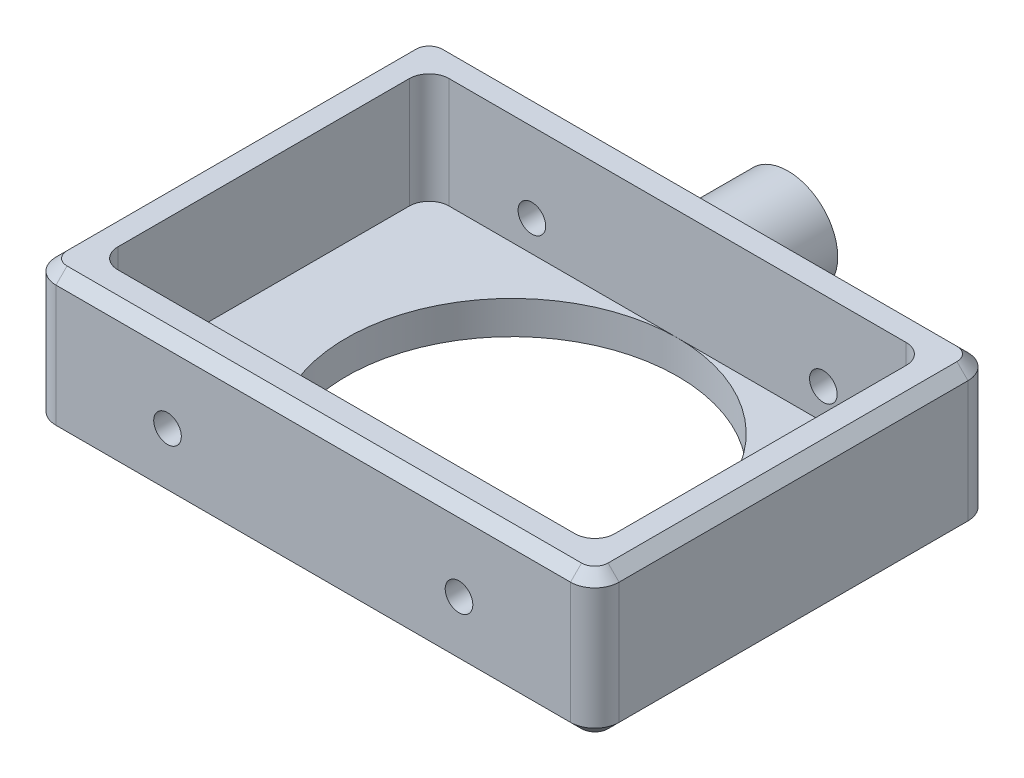
ISO-10303-21;
HEADER;
FILE_DESCRIPTION(('STEP AP214'),'2;1');
FILE_NAME('part.step','',(''),(''),'','','');
FILE_SCHEMA(('AUTOMOTIVE_DESIGN { 1 0 10303 214 1 1 1 1 }'));
ENDSEC;
DATA;
#1=APPLICATION_CONTEXT('core data for automotive mechanical design processes');
#2=APPLICATION_PROTOCOL_DEFINITION('international standard','automotive_design',2000,#1);
#3=PRODUCT_CONTEXT('',#1,'mechanical');
#4=PRODUCT('Part','Part','',(#3));
#5=PRODUCT_RELATED_PRODUCT_CATEGORY('part','',(#4));
#6=PRODUCT_DEFINITION_FORMATION('','',#4);
#7=PRODUCT_DEFINITION_CONTEXT('part definition',#1,'design');
#8=PRODUCT_DEFINITION('design','',#6,#7);
#9=PRODUCT_DEFINITION_SHAPE('','',#8);
#10=(LENGTH_UNIT() NAMED_UNIT(*) SI_UNIT(.MILLI.,.METRE.));
#11=(NAMED_UNIT(*) PLANE_ANGLE_UNIT() SI_UNIT($,.RADIAN.));
#12=(NAMED_UNIT(*) SI_UNIT($,.STERADIAN.) SOLID_ANGLE_UNIT());
#13=UNCERTAINTY_MEASURE_WITH_UNIT(LENGTH_MEASURE(1.E-05),#10,'distance_accuracy_value','');
#14=(GEOMETRIC_REPRESENTATION_CONTEXT(3) GLOBAL_UNCERTAINTY_ASSIGNED_CONTEXT((#13)) GLOBAL_UNIT_ASSIGNED_CONTEXT((#10,
#11,#12)) REPRESENTATION_CONTEXT('',''));
#15=CARTESIAN_POINT('',(0.,0.,0.));
#16=DIRECTION('',(0.,0.,1.));
#17=DIRECTION('',(1.,0.,0.));
#18=AXIS2_PLACEMENT_3D('',#15,#16,#17);
#19=CARTESIAN_POINT('',(-25.5,3.,-18.));
#20=DIRECTION('',(0.,0.,1.));
#21=DIRECTION('',(1.,0.,0.));
#22=AXIS2_PLACEMENT_3D('',#19,#20,#21);
#23=PLANE('',#22);
#24=DIRECTION('',(0.,-1.,0.));
#25=VECTOR('',#24,1.);
#26=CARTESIAN_POINT('',(-23.3,3.,-18.));
#27=LINE('',#26,#25);
#28=CARTESIAN_POINT('',(-23.3,1.00000000000001,-18.));
#29=VERTEX_POINT('',#28);
#30=CARTESIAN_POINT('',(-23.3,12.,-18.));
#31=VERTEX_POINT('',#30);
#32=EDGE_CURVE('E291',#29,#31,#27,.F.);
#33=ORIENTED_EDGE('',*,*,#32,.T.);
#34=DIRECTION('',(1.,0.,0.));
#35=VECTOR('',#34,1.);
#36=CARTESIAN_POINT('',(23.3,12.,-18.));
#37=LINE('',#36,#35);
#38=CARTESIAN_POINT('',(23.3,12.,-18.));
#39=VERTEX_POINT('',#38);
#40=EDGE_CURVE('E391',#31,#39,#37,.T.);
#41=ORIENTED_EDGE('',*,*,#40,.T.);
#42=DIRECTION('',(0.,-1.,0.));
#43=VECTOR('',#42,1.);
#44=CARTESIAN_POINT('',(23.3,3.,-18.));
#45=LINE('',#44,#43);
#46=CARTESIAN_POINT('',(23.3,1.00000000000001,-18.));
#47=VERTEX_POINT('',#46);
#48=EDGE_CURVE('E289',#39,#47,#45,.T.);
#49=ORIENTED_EDGE('',*,*,#48,.T.);
#50=DIRECTION('',(-1.,0.,0.));
#51=VECTOR('',#50,1.);
#52=CARTESIAN_POINT('',(-23.3,1.00000000000001,-18.));
#53=LINE('',#52,#51);
#54=EDGE_CURVE('E338',#47,#29,#53,.T.);
#55=ORIENTED_EDGE('',*,*,#54,.T.);
#56=EDGE_LOOP('',(#33,#41,#49,#55));
#57=FACE_BOUND('',#56,.T.);
#58=CARTESIAN_POINT('',(-13.2,5.8,-18.));
#59=DIRECTION('',(0.,0.,1.));
#60=DIRECTION('',(1.,0.,0.));
#61=AXIS2_PLACEMENT_3D('',#58,#59,#60);
#62=CIRCLE('',#61,1.25);
#63=CARTESIAN_POINT('',(-11.95,5.8,-18.));
#64=VERTEX_POINT('',#63);
#65=EDGE_CURVE('E214',#64,#64,#62,.T.);
#66=ORIENTED_EDGE('',*,*,#65,.T.);
#67=EDGE_LOOP('',(#66));
#68=FACE_BOUND('',#67,.T.);
#69=CARTESIAN_POINT('',(13.2,5.8,-18.));
#70=DIRECTION('',(0.,0.,1.));
#71=DIRECTION('',(1.,0.,0.));
#72=AXIS2_PLACEMENT_3D('',#69,#70,#71);
#73=CIRCLE('',#72,1.25);
#74=CARTESIAN_POINT('',(14.45,5.8,-18.));
#75=VERTEX_POINT('',#74);
#76=EDGE_CURVE('E438',#75,#75,#73,.T.);
#77=ORIENTED_EDGE('',*,*,#76,.T.);
#78=EDGE_LOOP('',(#77));
#79=FACE_BOUND('',#78,.T.);
#80=CARTESIAN_POINT('',(0.,6.60000000000001,-18.));
#81=DIRECTION('',(0.,0.,1.));
#82=DIRECTION('',(1.,0.,0.));
#83=AXIS2_PLACEMENT_3D('',#80,#81,#82);
#84=CIRCLE('',#83,4.5);
#85=CARTESIAN_POINT('',(4.5,6.60000000000001,-18.));
#86=VERTEX_POINT('',#85);
#87=EDGE_CURVE('E11',#86,#86,#84,.F.);
#88=ORIENTED_EDGE('',*,*,#87,.F.);
#89=EDGE_LOOP('',(#88));
#90=FACE_BOUND('',#89,.T.);
#91=ADVANCED_FACE('F39',(#57,#68,#79,#90),#23,.F.);
#92=CARTESIAN_POINT('',(0.,3.,0.));
#93=DIRECTION('',(0.,-1.,0.));
#94=DIRECTION('',(0.,0.,-1.));
#95=AXIS2_PLACEMENT_3D('',#92,#93,#94);
#96=PLANE('',#95);
#97=CARTESIAN_POINT('',(0.,3.,0.));
#98=DIRECTION('',(0.,1.,0.));
#99=DIRECTION('',(0.,0.,1.));
#100=AXIS2_PLACEMENT_3D('',#97,#98,#99);
#101=CIRCLE('',#100,15.);
#102=CARTESIAN_POINT('',(0.,3.,15.));
#103=VERTEX_POINT('',#102);
#104=CARTESIAN_POINT('',(0.,3.,-15.));
#105=VERTEX_POINT('',#104);
#106=EDGE_CURVE('E209',#103,#105,#101,.T.);
#107=ORIENTED_EDGE('',*,*,#106,.F.);
#108=DIRECTION('',(1.,0.,0.));
#109=VECTOR('',#108,1.);
#110=CARTESIAN_POINT('',(0.,3.,15.));
#111=LINE('',#110,#109);
#112=CARTESIAN_POINT('',(20.7,3.,15.));
#113=VERTEX_POINT('',#112);
#114=EDGE_CURVE('E219',#103,#113,#111,.T.);
#115=ORIENTED_EDGE('',*,*,#114,.T.);
#116=CARTESIAN_POINT('',(20.7,3.,13.2));
#117=DIRECTION('',(0.,-1.,0.));
#118=DIRECTION('',(0.,0.,-1.));
#119=AXIS2_PLACEMENT_3D('',#116,#117,#118);
#120=CIRCLE('',#119,1.8);
#121=CARTESIAN_POINT('',(22.5,3.,13.2));
#122=VERTEX_POINT('',#121);
#123=EDGE_CURVE('E259',#113,#122,#120,.F.);
#124=ORIENTED_EDGE('',*,*,#123,.T.);
#125=DIRECTION('',(0.,0.,1.));
#126=VECTOR('',#125,1.);
#127=CARTESIAN_POINT('',(22.5,3.,0.));
#128=LINE('',#127,#126);
#129=CARTESIAN_POINT('',(22.5,3.,-13.2));
#130=VERTEX_POINT('',#129);
#131=EDGE_CURVE('E247',#130,#122,#128,.T.);
#132=ORIENTED_EDGE('',*,*,#131,.F.);
#133=CARTESIAN_POINT('',(20.7,3.,-13.2));
#134=DIRECTION('',(0.,-1.,0.));
#135=DIRECTION('',(0.,0.,-1.));
#136=AXIS2_PLACEMENT_3D('',#133,#134,#135);
#137=CIRCLE('',#136,1.8);
#138=CARTESIAN_POINT('',(20.7,3.,-15.));
#139=VERTEX_POINT('',#138);
#140=EDGE_CURVE('E256',#130,#139,#137,.F.);
#141=ORIENTED_EDGE('',*,*,#140,.T.);
#142=DIRECTION('',(1.,0.,0.));
#143=VECTOR('',#142,1.);
#144=CARTESIAN_POINT('',(0.,3.,-15.));
#145=LINE('',#144,#143);
#146=EDGE_CURVE('E222',#105,#139,#145,.T.);
#147=ORIENTED_EDGE('',*,*,#146,.F.);
#148=EDGE_LOOP('',(#107,#115,#124,#132,#141,#147));
#149=FACE_BOUND('',#148,.T.);
#150=ADVANCED_FACE('F218',(#149),#96,.F.);
#151=EDGE_CURVE('E206',#105,#103,#101,.T.);
#152=ORIENTED_EDGE('',*,*,#151,.F.);
#153=CARTESIAN_POINT('',(-20.7,3.,-15.));
#154=VERTEX_POINT('',#153);
#155=EDGE_CURVE('E245',#154,#105,#145,.T.);
#156=ORIENTED_EDGE('',*,*,#155,.F.);
#157=CARTESIAN_POINT('',(-20.7,3.,-13.2));
#158=DIRECTION('',(0.,-1.,0.));
#159=DIRECTION('',(0.,0.,-1.));
#160=AXIS2_PLACEMENT_3D('',#157,#158,#159);
#161=CIRCLE('',#160,1.8);
#162=CARTESIAN_POINT('',(-22.5,3.,-13.2));
#163=VERTEX_POINT('',#162);
#164=EDGE_CURVE('E254',#154,#163,#161,.F.);
#165=ORIENTED_EDGE('',*,*,#164,.T.);
#166=DIRECTION('',(0.,0.,1.));
#167=VECTOR('',#166,1.);
#168=CARTESIAN_POINT('',(-22.5,3.,0.));
#169=LINE('',#168,#167);
#170=CARTESIAN_POINT('',(-22.5,3.,13.2));
#171=VERTEX_POINT('',#170);
#172=EDGE_CURVE('E239',#163,#171,#169,.T.);
#173=ORIENTED_EDGE('',*,*,#172,.T.);
#174=CARTESIAN_POINT('',(-20.7,3.,13.2));
#175=DIRECTION('',(0.,-1.,0.));
#176=DIRECTION('',(0.,0.,-1.));
#177=AXIS2_PLACEMENT_3D('',#174,#175,#176);
#178=CIRCLE('',#177,1.8);
#179=CARTESIAN_POINT('',(-20.7,3.,15.));
#180=VERTEX_POINT('',#179);
#181=EDGE_CURVE('E238',#171,#180,#178,.F.);
#182=ORIENTED_EDGE('',*,*,#181,.T.);
#183=EDGE_CURVE('E230',#180,#103,#111,.T.);
#184=ORIENTED_EDGE('',*,*,#183,.T.);
#185=EDGE_LOOP('',(#152,#156,#165,#173,#182,#184));
#186=FACE_BOUND('',#185,.T.);
#187=ADVANCED_FACE('F236',(#186),#96,.F.);
#188=CARTESIAN_POINT('',(25.5,3.,18.));
#189=DIRECTION('',(-1.,0.,0.));
#190=DIRECTION('',(0.,0.,1.));
#191=AXIS2_PLACEMENT_3D('',#188,#189,#190);
#192=PLANE('',#191);
#193=DIRECTION('',(0.,-1.,0.));
#194=VECTOR('',#193,1.);
#195=CARTESIAN_POINT('',(25.5,3.,-15.8));
#196=LINE('',#195,#194);
#197=CARTESIAN_POINT('',(25.5,1.00000000000001,-15.8));
#198=VERTEX_POINT('',#197);
#199=CARTESIAN_POINT('',(25.5,12.,-15.8));
#200=VERTEX_POINT('',#199);
#201=EDGE_CURVE('E300',#198,#200,#196,.F.);
#202=ORIENTED_EDGE('',*,*,#201,.T.);
#203=DIRECTION('',(0.,0.,1.));
#204=VECTOR('',#203,1.);
#205=CARTESIAN_POINT('',(25.5,12.,15.8));
#206=LINE('',#205,#204);
#207=CARTESIAN_POINT('',(25.5,12.,15.8));
#208=VERTEX_POINT('',#207);
#209=EDGE_CURVE('E400',#200,#208,#206,.T.);
#210=ORIENTED_EDGE('',*,*,#209,.T.);
#211=DIRECTION('',(0.,-1.,0.));
#212=VECTOR('',#211,1.);
#213=CARTESIAN_POINT('',(25.5,3.,15.8));
#214=LINE('',#213,#212);
#215=CARTESIAN_POINT('',(25.5,1.00000000000001,15.8));
#216=VERTEX_POINT('',#215);
#217=EDGE_CURVE('E298',#208,#216,#214,.T.);
#218=ORIENTED_EDGE('',*,*,#217,.T.);
#219=DIRECTION('',(0.,0.,-1.));
#220=VECTOR('',#219,1.);
#221=CARTESIAN_POINT('',(25.5,1.00000000000001,-15.8));
#222=LINE('',#221,#220);
#223=EDGE_CURVE('E325',#216,#198,#222,.T.);
#224=ORIENTED_EDGE('',*,*,#223,.T.);
#225=EDGE_LOOP('',(#202,#210,#218,#224));
#226=FACE_BOUND('',#225,.T.);
#227=ADVANCED_FACE('F507',(#226),#192,.F.);
#228=CARTESIAN_POINT('',(-25.5,3.,18.));
#229=DIRECTION('',(1.,0.,0.));
#230=DIRECTION('',(0.,0.,-1.));
#231=AXIS2_PLACEMENT_3D('',#228,#229,#230);
#232=PLANE('',#231);
#233=DIRECTION('',(0.,-1.,0.));
#234=VECTOR('',#233,1.);
#235=CARTESIAN_POINT('',(-25.5,3.,15.8));
#236=LINE('',#235,#234);
#237=CARTESIAN_POINT('',(-25.5,1.00000000000001,15.8));
#238=VERTEX_POINT('',#237);
#239=CARTESIAN_POINT('',(-25.5,12.,15.8));
#240=VERTEX_POINT('',#239);
#241=EDGE_CURVE('E284',#238,#240,#236,.F.);
#242=ORIENTED_EDGE('',*,*,#241,.T.);
#243=DIRECTION('',(0.,0.,-1.));
#244=VECTOR('',#243,1.);
#245=CARTESIAN_POINT('',(-25.5,12.,-15.8));
#246=LINE('',#245,#244);
#247=CARTESIAN_POINT('',(-25.5,12.,-15.8));
#248=VERTEX_POINT('',#247);
#249=EDGE_CURVE('E398',#240,#248,#246,.T.);
#250=ORIENTED_EDGE('',*,*,#249,.T.);
#251=DIRECTION('',(0.,-1.,0.));
#252=VECTOR('',#251,1.);
#253=CARTESIAN_POINT('',(-25.5,3.,-15.8));
#254=LINE('',#253,#252);
#255=CARTESIAN_POINT('',(-25.5,1.00000000000001,-15.8));
#256=VERTEX_POINT('',#255);
#257=EDGE_CURVE('E287',#248,#256,#254,.T.);
#258=ORIENTED_EDGE('',*,*,#257,.T.);
#259=DIRECTION('',(0.,0.,1.));
#260=VECTOR('',#259,1.);
#261=CARTESIAN_POINT('',(-25.5,1.00000000000001,15.8));
#262=LINE('',#261,#260);
#263=EDGE_CURVE('E333',#256,#238,#262,.T.);
#264=ORIENTED_EDGE('',*,*,#263,.T.);
#265=EDGE_LOOP('',(#242,#250,#258,#264));
#266=FACE_BOUND('',#265,.T.);
#267=ADVANCED_FACE('F505',(#266),#232,.F.);
#268=CARTESIAN_POINT('',(-25.5,3.,18.));
#269=DIRECTION('',(0.,0.,-1.));
#270=DIRECTION('',(-1.,0.,0.));
#271=AXIS2_PLACEMENT_3D('',#268,#269,#270);
#272=PLANE('',#271);
#273=CARTESIAN_POINT('',(13.2,5.8,18.));
#274=DIRECTION('',(0.,0.,1.));
#275=DIRECTION('',(1.,0.,0.));
#276=AXIS2_PLACEMENT_3D('',#273,#274,#275);
#277=CIRCLE('',#276,1.25);
#278=CARTESIAN_POINT('',(14.45,5.8,18.));
#279=VERTEX_POINT('',#278);
#280=EDGE_CURVE('E374',#279,#279,#277,.T.);
#281=ORIENTED_EDGE('',*,*,#280,.F.);
#282=EDGE_LOOP('',(#281));
#283=FACE_BOUND('',#282,.T.);
#284=CARTESIAN_POINT('',(-13.2,5.8,18.));
#285=DIRECTION('',(0.,0.,1.));
#286=DIRECTION('',(1.,0.,0.));
#287=AXIS2_PLACEMENT_3D('',#284,#285,#286);
#288=CIRCLE('',#287,1.25);
#289=CARTESIAN_POINT('',(-11.95,5.8,18.));
#290=VERTEX_POINT('',#289);
#291=EDGE_CURVE('E369',#290,#290,#288,.T.);
#292=ORIENTED_EDGE('',*,*,#291,.F.);
#293=EDGE_LOOP('',(#292));
#294=FACE_BOUND('',#293,.T.);
#295=DIRECTION('',(0.,-1.,0.));
#296=VECTOR('',#295,1.);
#297=CARTESIAN_POINT('',(23.3,3.,18.));
#298=LINE('',#297,#296);
#299=CARTESIAN_POINT('',(23.3,1.00000000000001,18.));
#300=VERTEX_POINT('',#299);
#301=CARTESIAN_POINT('',(23.3,12.,18.));
#302=VERTEX_POINT('',#301);
#303=EDGE_CURVE('E294',#300,#302,#298,.F.);
#304=ORIENTED_EDGE('',*,*,#303,.T.);
#305=DIRECTION('',(-1.,0.,0.));
#306=VECTOR('',#305,1.);
#307=CARTESIAN_POINT('',(-23.3,12.,18.));
#308=LINE('',#307,#306);
#309=CARTESIAN_POINT('',(-23.3,12.,18.));
#310=VERTEX_POINT('',#309);
#311=EDGE_CURVE('E47',#302,#310,#308,.T.);
#312=ORIENTED_EDGE('',*,*,#311,.T.);
#313=DIRECTION('',(0.,-1.,0.));
#314=VECTOR('',#313,1.);
#315=CARTESIAN_POINT('',(-23.3,3.,18.));
#316=LINE('',#315,#314);
#317=CARTESIAN_POINT('',(-23.3,1.00000000000001,18.));
#318=VERTEX_POINT('',#317);
#319=EDGE_CURVE('E296',#310,#318,#316,.T.);
#320=ORIENTED_EDGE('',*,*,#319,.T.);
#321=DIRECTION('',(1.,0.,0.));
#322=VECTOR('',#321,1.);
#323=CARTESIAN_POINT('',(23.3,1.00000000000001,18.));
#324=LINE('',#323,#322);
#325=EDGE_CURVE('E323',#318,#300,#324,.T.);
#326=ORIENTED_EDGE('',*,*,#325,.T.);
#327=EDGE_LOOP('',(#304,#312,#320,#326));
#328=FACE_BOUND('',#327,.T.);
#329=ADVANCED_FACE('F514',(#283,#294,#328),#272,.F.);
#330=CARTESIAN_POINT('',(0.,0.,0.));
#331=DIRECTION('',(0.,-1.,0.));
#332=DIRECTION('',(0.,0.,-1.));
#333=AXIS2_PLACEMENT_3D('',#330,#331,#332);
#334=PLANE('',#333);
#335=CARTESIAN_POINT('',(0.,0.,0.));
#336=DIRECTION('',(0.,-1.,0.));
#337=DIRECTION('',(0.,0.,-1.));
#338=AXIS2_PLACEMENT_3D('',#335,#336,#337);
#339=CIRCLE('',#338,15.);
#340=CARTESIAN_POINT('',(0.,0.,-15.));
#341=VERTEX_POINT('',#340);
#342=EDGE_CURVE('E224',#341,#341,#339,.T.);
#343=ORIENTED_EDGE('',*,*,#342,.F.);
#344=EDGE_LOOP('',(#343));
#345=FACE_BOUND('',#344,.T.);
#346=DIRECTION('',(0.,0.,1.));
#347=VECTOR('',#346,1.);
#348=CARTESIAN_POINT('',(24.5,0.,15.8));
#349=LINE('',#348,#347);
#350=CARTESIAN_POINT('',(24.5,0.,-15.8));
#351=VERTEX_POINT('',#350);
#352=CARTESIAN_POINT('',(24.5,0.,15.8));
#353=VERTEX_POINT('',#352);
#354=EDGE_CURVE('E313',#351,#353,#349,.T.);
#355=ORIENTED_EDGE('',*,*,#354,.T.);
#356=CARTESIAN_POINT('',(23.3,0.,15.8));
#357=DIRECTION('',(0.,-1.,0.));
#358=DIRECTION('',(0.,0.,-1.));
#359=AXIS2_PLACEMENT_3D('',#356,#357,#358);
#360=CIRCLE('',#359,1.19999999999999);
#361=CARTESIAN_POINT('',(23.3,0.,17.));
#362=VERTEX_POINT('',#361);
#363=EDGE_CURVE('E317',#353,#362,#360,.T.);
#364=ORIENTED_EDGE('',*,*,#363,.T.);
#365=DIRECTION('',(-1.,0.,0.));
#366=VECTOR('',#365,1.);
#367=CARTESIAN_POINT('',(-23.3,0.,17.));
#368=LINE('',#367,#366);
#369=CARTESIAN_POINT('',(-23.3,0.,17.));
#370=VERTEX_POINT('',#369);
#371=EDGE_CURVE('E315',#362,#370,#368,.T.);
#372=ORIENTED_EDGE('',*,*,#371,.T.);
#373=CARTESIAN_POINT('',(-23.3,0.,15.8));
#374=DIRECTION('',(0.,-1.,0.));
#375=DIRECTION('',(0.,0.,-1.));
#376=AXIS2_PLACEMENT_3D('',#373,#374,#375);
#377=CIRCLE('',#376,1.19999999999999);
#378=CARTESIAN_POINT('',(-24.5,0.,15.8));
#379=VERTEX_POINT('',#378);
#380=EDGE_CURVE('E311',#370,#379,#377,.T.);
#381=ORIENTED_EDGE('',*,*,#380,.T.);
#382=DIRECTION('',(0.,0.,-1.));
#383=VECTOR('',#382,1.);
#384=CARTESIAN_POINT('',(-24.5,0.,-15.8));
#385=LINE('',#384,#383);
#386=CARTESIAN_POINT('',(-24.5,0.,-15.8));
#387=VERTEX_POINT('',#386);
#388=EDGE_CURVE('E307',#379,#387,#385,.T.);
#389=ORIENTED_EDGE('',*,*,#388,.T.);
#390=CARTESIAN_POINT('',(-23.3,0.,-15.8));
#391=DIRECTION('',(0.,-1.,0.));
#392=DIRECTION('',(0.,0.,-1.));
#393=AXIS2_PLACEMENT_3D('',#390,#391,#392);
#394=CIRCLE('',#393,1.19999999999999);
#395=CARTESIAN_POINT('',(-23.3,0.,-17.));
#396=VERTEX_POINT('',#395);
#397=EDGE_CURVE('E305',#387,#396,#394,.T.);
#398=ORIENTED_EDGE('',*,*,#397,.T.);
#399=DIRECTION('',(1.,0.,0.));
#400=VECTOR('',#399,1.);
#401=CARTESIAN_POINT('',(23.3,0.,-17.));
#402=LINE('',#401,#400);
#403=CARTESIAN_POINT('',(23.3,0.,-17.));
#404=VERTEX_POINT('',#403);
#405=EDGE_CURVE('E303',#396,#404,#402,.T.);
#406=ORIENTED_EDGE('',*,*,#405,.T.);
#407=CARTESIAN_POINT('',(23.3,0.,-15.8));
#408=DIRECTION('',(0.,-1.,0.));
#409=DIRECTION('',(0.,0.,-1.));
#410=AXIS2_PLACEMENT_3D('',#407,#408,#409);
#411=CIRCLE('',#410,1.19999999999999);
#412=EDGE_CURVE('E309',#404,#351,#411,.T.);
#413=ORIENTED_EDGE('',*,*,#412,.T.);
#414=EDGE_LOOP('',(#355,#364,#372,#381,#389,#398,#406,#413));
#415=FACE_BOUND('',#414,.T.);
#416=ADVANCED_FACE('F801',(#345,#415),#334,.T.);
#417=CARTESIAN_POINT('',(0.,13.,15.));
#418=DIRECTION('',(0.,0.,-1.));
#419=DIRECTION('',(-1.,0.,0.));
#420=AXIS2_PLACEMENT_3D('',#417,#418,#419);
#421=PLANE('',#420);
#422=CARTESIAN_POINT('',(13.2,5.8,15.));
#423=DIRECTION('',(0.,0.,-1.));
#424=DIRECTION('',(-1.,0.,0.));
#425=AXIS2_PLACEMENT_3D('',#422,#423,#424);
#426=CIRCLE('',#425,1.25);
#427=CARTESIAN_POINT('',(11.95,5.8,15.));
#428=VERTEX_POINT('',#427);
#429=EDGE_CURVE('E373',#428,#428,#426,.T.);
#430=ORIENTED_EDGE('',*,*,#429,.F.);
#431=EDGE_LOOP('',(#430));
#432=FACE_BOUND('',#431,.T.);
#433=CARTESIAN_POINT('',(-13.2,5.8,15.));
#434=DIRECTION('',(0.,0.,-1.));
#435=DIRECTION('',(-1.,0.,0.));
#436=AXIS2_PLACEMENT_3D('',#433,#434,#435);
#437=CIRCLE('',#436,1.25);
#438=CARTESIAN_POINT('',(-14.45,5.8,15.));
#439=VERTEX_POINT('',#438);
#440=EDGE_CURVE('E368',#439,#439,#437,.T.);
#441=ORIENTED_EDGE('',*,*,#440,.F.);
#442=EDGE_LOOP('',(#441));
#443=FACE_BOUND('',#442,.T.);
#444=DIRECTION('',(1.,0.,0.));
#445=VECTOR('',#444,1.);
#446=CARTESIAN_POINT('',(0.,13.,15.));
#447=LINE('',#446,#445);
#448=CARTESIAN_POINT('',(-20.7,13.,15.));
#449=VERTEX_POINT('',#448);
#450=CARTESIAN_POINT('',(20.7,13.,15.));
#451=VERTEX_POINT('',#450);
#452=EDGE_CURVE('E250',#449,#451,#447,.T.);
#453=ORIENTED_EDGE('',*,*,#452,.T.);
#454=DIRECTION('',(0.,-1.,0.));
#455=VECTOR('',#454,1.);
#456=CARTESIAN_POINT('',(20.7,13.,15.));
#457=LINE('',#456,#455);
#458=EDGE_CURVE('E233',#451,#113,#457,.T.);
#459=ORIENTED_EDGE('',*,*,#458,.T.);
#460=ORIENTED_EDGE('',*,*,#114,.F.);
#461=ORIENTED_EDGE('',*,*,#183,.F.);
#462=DIRECTION('',(0.,-1.,0.));
#463=VECTOR('',#462,1.);
#464=CARTESIAN_POINT('',(-20.7,13.,15.));
#465=LINE('',#464,#463);
#466=EDGE_CURVE('E251',#180,#449,#465,.F.);
#467=ORIENTED_EDGE('',*,*,#466,.T.);
#468=EDGE_LOOP('',(#453,#459,#460,#461,#467));
#469=FACE_BOUND('',#468,.T.);
#470=ADVANCED_FACE('F229',(#432,#443,#469),#421,.T.);
#471=CARTESIAN_POINT('',(-22.5,13.,0.));
#472=DIRECTION('',(1.,0.,0.));
#473=DIRECTION('',(0.,0.,-1.));
#474=AXIS2_PLACEMENT_3D('',#471,#472,#473);
#475=PLANE('',#474);
#476=DIRECTION('',(0.,0.,1.));
#477=VECTOR('',#476,1.);
#478=CARTESIAN_POINT('',(-22.5,13.,0.));
#479=LINE('',#478,#477);
#480=CARTESIAN_POINT('',(-22.5,13.,-13.2));
#481=VERTEX_POINT('',#480);
#482=CARTESIAN_POINT('',(-22.5,13.,13.2));
#483=VERTEX_POINT('',#482);
#484=EDGE_CURVE('E448',#481,#483,#479,.T.);
#485=ORIENTED_EDGE('',*,*,#484,.T.);
#486=DIRECTION('',(0.,-1.,0.));
#487=VECTOR('',#486,1.);
#488=CARTESIAN_POINT('',(-22.5,3.,13.2));
#489=LINE('',#488,#487);
#490=EDGE_CURVE('E268',#483,#171,#489,.T.);
#491=ORIENTED_EDGE('',*,*,#490,.T.);
#492=ORIENTED_EDGE('',*,*,#172,.F.);
#493=DIRECTION('',(0.,-1.,0.));
#494=VECTOR('',#493,1.);
#495=CARTESIAN_POINT('',(-22.5,13.,-13.2));
#496=LINE('',#495,#494);
#497=EDGE_CURVE('E266',#163,#481,#496,.F.);
#498=ORIENTED_EDGE('',*,*,#497,.T.);
#499=EDGE_LOOP('',(#485,#491,#492,#498));
#500=FACE_BOUND('',#499,.T.);
#501=ADVANCED_FACE('F477',(#500),#475,.T.);
#502=CARTESIAN_POINT('',(0.,13.,-15.));
#503=DIRECTION('',(0.,0.,-1.));
#504=DIRECTION('',(-1.,0.,0.));
#505=AXIS2_PLACEMENT_3D('',#502,#503,#504);
#506=PLANE('',#505);
#507=CARTESIAN_POINT('',(13.2,5.8,-15.));
#508=DIRECTION('',(0.,0.,-1.));
#509=DIRECTION('',(-1.,0.,0.));
#510=AXIS2_PLACEMENT_3D('',#507,#508,#509);
#511=CIRCLE('',#510,1.25);
#512=CARTESIAN_POINT('',(11.95,5.8,-15.));
#513=VERTEX_POINT('',#512);
#514=EDGE_CURVE('E370',#513,#513,#511,.T.);
#515=ORIENTED_EDGE('',*,*,#514,.T.);
#516=EDGE_LOOP('',(#515));
#517=FACE_BOUND('',#516,.T.);
#518=CARTESIAN_POINT('',(-13.2,5.8,-15.));
#519=DIRECTION('',(0.,0.,-1.));
#520=DIRECTION('',(-1.,0.,0.));
#521=AXIS2_PLACEMENT_3D('',#518,#519,#520);
#522=CIRCLE('',#521,1.25);
#523=CARTESIAN_POINT('',(-14.45,5.8,-15.));
#524=VERTEX_POINT('',#523);
#525=EDGE_CURVE('E365',#524,#524,#522,.T.);
#526=ORIENTED_EDGE('',*,*,#525,.T.);
#527=EDGE_LOOP('',(#526));
#528=FACE_BOUND('',#527,.T.);
#529=ORIENTED_EDGE('',*,*,#155,.T.);
#530=ORIENTED_EDGE('',*,*,#146,.T.);
#531=DIRECTION('',(0.,-1.,0.));
#532=VECTOR('',#531,1.);
#533=CARTESIAN_POINT('',(20.7,13.,-15.));
#534=LINE('',#533,#532);
#535=CARTESIAN_POINT('',(20.7,13.,-15.));
#536=VERTEX_POINT('',#535);
#537=EDGE_CURVE('E274',#139,#536,#534,.F.);
#538=ORIENTED_EDGE('',*,*,#537,.T.);
#539=DIRECTION('',(1.,0.,0.));
#540=VECTOR('',#539,1.);
#541=CARTESIAN_POINT('',(0.,13.,-15.));
#542=LINE('',#541,#540);
#543=CARTESIAN_POINT('',(-20.7,13.,-15.));
#544=VERTEX_POINT('',#543);
#545=EDGE_CURVE('E450',#544,#536,#542,.T.);
#546=ORIENTED_EDGE('',*,*,#545,.F.);
#547=DIRECTION('',(0.,-1.,0.));
#548=VECTOR('',#547,1.);
#549=CARTESIAN_POINT('',(-20.7,13.,-15.));
#550=LINE('',#549,#548);
#551=EDGE_CURVE('E271',#544,#154,#550,.T.);
#552=ORIENTED_EDGE('',*,*,#551,.T.);
#553=EDGE_LOOP('',(#529,#530,#538,#546,#552));
#554=FACE_BOUND('',#553,.T.);
#555=ADVANCED_FACE('F471',(#517,#528,#554),#506,.F.);
#556=CARTESIAN_POINT('',(22.5,13.,0.));
#557=DIRECTION('',(1.,0.,0.));
#558=DIRECTION('',(0.,0.,-1.));
#559=AXIS2_PLACEMENT_3D('',#556,#557,#558);
#560=PLANE('',#559);
#561=ORIENTED_EDGE('',*,*,#131,.T.);
#562=DIRECTION('',(0.,-1.,0.));
#563=VECTOR('',#562,1.);
#564=CARTESIAN_POINT('',(22.5,13.,13.2));
#565=LINE('',#564,#563);
#566=CARTESIAN_POINT('',(22.5,13.,13.2));
#567=VERTEX_POINT('',#566);
#568=EDGE_CURVE('E264',#122,#567,#565,.F.);
#569=ORIENTED_EDGE('',*,*,#568,.T.);
#570=DIRECTION('',(0.,0.,1.));
#571=VECTOR('',#570,1.);
#572=CARTESIAN_POINT('',(22.5,13.,0.));
#573=LINE('',#572,#571);
#574=CARTESIAN_POINT('',(22.5,13.,-13.2));
#575=VERTEX_POINT('',#574);
#576=EDGE_CURVE('E242',#575,#567,#573,.T.);
#577=ORIENTED_EDGE('',*,*,#576,.F.);
#578=DIRECTION('',(0.,-1.,0.));
#579=VECTOR('',#578,1.);
#580=CARTESIAN_POINT('',(22.5,3.,-13.2));
#581=LINE('',#580,#579);
#582=EDGE_CURVE('E261',#575,#130,#581,.T.);
#583=ORIENTED_EDGE('',*,*,#582,.T.);
#584=EDGE_LOOP('',(#561,#569,#577,#583));
#585=FACE_BOUND('',#584,.T.);
#586=ADVANCED_FACE('F466',(#585),#560,.F.);
#587=CARTESIAN_POINT('',(0.,13.,0.));
#588=DIRECTION('',(0.,1.,0.));
#589=DIRECTION('',(0.,0.,1.));
#590=AXIS2_PLACEMENT_3D('',#587,#588,#589);
#591=PLANE('',#590);
#592=CARTESIAN_POINT('',(23.3,13.,-15.8));
#593=DIRECTION('',(0.,1.,0.));
#594=DIRECTION('',(0.,0.,1.));
#595=AXIS2_PLACEMENT_3D('',#592,#593,#594);
#596=CIRCLE('',#595,1.2);
#597=CARTESIAN_POINT('',(24.5,13.,-15.8));
#598=VERTEX_POINT('',#597);
#599=CARTESIAN_POINT('',(23.3,13.,-17.));
#600=VERTEX_POINT('',#599);
#601=EDGE_CURVE('E384',#598,#600,#596,.T.);
#602=ORIENTED_EDGE('',*,*,#601,.T.);
#603=DIRECTION('',(-1.,0.,0.));
#604=VECTOR('',#603,1.);
#605=CARTESIAN_POINT('',(-23.3,13.,-17.));
#606=LINE('',#605,#604);
#607=CARTESIAN_POINT('',(-23.3,13.,-17.));
#608=VERTEX_POINT('',#607);
#609=EDGE_CURVE('E388',#600,#608,#606,.T.);
#610=ORIENTED_EDGE('',*,*,#609,.T.);
#611=CARTESIAN_POINT('',(-23.3,13.,-15.8));
#612=DIRECTION('',(0.,1.,0.));
#613=DIRECTION('',(0.,0.,1.));
#614=AXIS2_PLACEMENT_3D('',#611,#612,#613);
#615=CIRCLE('',#614,1.2);
#616=CARTESIAN_POINT('',(-24.5,13.,-15.8));
#617=VERTEX_POINT('',#616);
#618=EDGE_CURVE('E386',#608,#617,#615,.T.);
#619=ORIENTED_EDGE('',*,*,#618,.T.);
#620=DIRECTION('',(0.,0.,1.));
#621=VECTOR('',#620,1.);
#622=CARTESIAN_POINT('',(-24.5,13.,15.8));
#623=LINE('',#622,#621);
#624=CARTESIAN_POINT('',(-24.5,13.,15.8));
#625=VERTEX_POINT('',#624);
#626=EDGE_CURVE('E382',#617,#625,#623,.T.);
#627=ORIENTED_EDGE('',*,*,#626,.T.);
#628=CARTESIAN_POINT('',(-23.3,13.,15.8));
#629=DIRECTION('',(0.,1.,0.));
#630=DIRECTION('',(0.,0.,1.));
#631=AXIS2_PLACEMENT_3D('',#628,#629,#630);
#632=CIRCLE('',#631,1.2);
#633=CARTESIAN_POINT('',(-23.3,13.,17.));
#634=VERTEX_POINT('',#633);
#635=EDGE_CURVE('E378',#625,#634,#632,.T.);
#636=ORIENTED_EDGE('',*,*,#635,.T.);
#637=DIRECTION('',(1.,0.,0.));
#638=VECTOR('',#637,1.);
#639=CARTESIAN_POINT('',(23.3,13.,17.));
#640=LINE('',#639,#638);
#641=CARTESIAN_POINT('',(23.3,13.,17.));
#642=VERTEX_POINT('',#641);
#643=EDGE_CURVE('E340',#634,#642,#640,.T.);
#644=ORIENTED_EDGE('',*,*,#643,.T.);
#645=CARTESIAN_POINT('',(23.3,13.,15.8));
#646=DIRECTION('',(0.,1.,0.));
#647=DIRECTION('',(0.,0.,1.));
#648=AXIS2_PLACEMENT_3D('',#645,#646,#647);
#649=CIRCLE('',#648,1.2);
#650=CARTESIAN_POINT('',(24.5,13.,15.8));
#651=VERTEX_POINT('',#650);
#652=EDGE_CURVE('E376',#642,#651,#649,.T.);
#653=ORIENTED_EDGE('',*,*,#652,.T.);
#654=DIRECTION('',(0.,0.,-1.));
#655=VECTOR('',#654,1.);
#656=CARTESIAN_POINT('',(24.5,13.,-15.8));
#657=LINE('',#656,#655);
#658=EDGE_CURVE('E380',#651,#598,#657,.T.);
#659=ORIENTED_EDGE('',*,*,#658,.T.);
#660=EDGE_LOOP('',(#602,#610,#619,#627,#636,#644,#653,#659));
#661=FACE_BOUND('',#660,.T.);
#662=ORIENTED_EDGE('',*,*,#452,.F.);
#663=CARTESIAN_POINT('',(-20.7,13.,13.2));
#664=DIRECTION('',(0.,1.,0.));
#665=DIRECTION('',(0.,0.,1.));
#666=AXIS2_PLACEMENT_3D('',#663,#664,#665);
#667=CIRCLE('',#666,1.8);
#668=EDGE_CURVE('E278',#449,#483,#667,.F.);
#669=ORIENTED_EDGE('',*,*,#668,.T.);
#670=ORIENTED_EDGE('',*,*,#484,.F.);
#671=CARTESIAN_POINT('',(-20.7,13.,-13.2));
#672=DIRECTION('',(0.,1.,0.));
#673=DIRECTION('',(0.,0.,1.));
#674=AXIS2_PLACEMENT_3D('',#671,#672,#673);
#675=CIRCLE('',#674,1.8);
#676=EDGE_CURVE('E282',#481,#544,#675,.F.);
#677=ORIENTED_EDGE('',*,*,#676,.T.);
#678=ORIENTED_EDGE('',*,*,#545,.T.);
#679=CARTESIAN_POINT('',(20.7,13.,-13.2));
#680=DIRECTION('',(0.,1.,0.));
#681=DIRECTION('',(0.,0.,1.));
#682=AXIS2_PLACEMENT_3D('',#679,#680,#681);
#683=CIRCLE('',#682,1.8);
#684=EDGE_CURVE('E280',#536,#575,#683,.F.);
#685=ORIENTED_EDGE('',*,*,#684,.T.);
#686=ORIENTED_EDGE('',*,*,#576,.T.);
#687=CARTESIAN_POINT('',(20.7,13.,13.2));
#688=DIRECTION('',(0.,1.,0.));
#689=DIRECTION('',(0.,0.,1.));
#690=AXIS2_PLACEMENT_3D('',#687,#688,#689);
#691=CIRCLE('',#690,1.8);
#692=EDGE_CURVE('E276',#567,#451,#691,.F.);
#693=ORIENTED_EDGE('',*,*,#692,.T.);
#694=EDGE_LOOP('',(#662,#669,#670,#677,#678,#685,#686,#693));
#695=FACE_BOUND('',#694,.T.);
#696=ADVANCED_FACE('F459',(#661,#695),#591,.T.);
#697=CARTESIAN_POINT('',(20.7,13.,13.2));
#698=DIRECTION('',(0.,-1.,0.));
#699=DIRECTION('',(0.,0.,-1.));
#700=AXIS2_PLACEMENT_3D('',#697,#698,#699);
#701=CYLINDRICAL_SURFACE('',#700,1.8);
#702=ORIENTED_EDGE('',*,*,#692,.F.);
#703=ORIENTED_EDGE('',*,*,#568,.F.);
#704=ORIENTED_EDGE('',*,*,#123,.F.);
#705=ORIENTED_EDGE('',*,*,#458,.F.);
#706=EDGE_LOOP('',(#702,#703,#704,#705));
#707=FACE_BOUND('',#706,.T.);
#708=ADVANCED_FACE('F464',(#707),#701,.F.);
#709=CARTESIAN_POINT('',(-20.7,13.,13.2));
#710=DIRECTION('',(0.,1.,0.));
#711=DIRECTION('',(0.,0.,1.));
#712=AXIS2_PLACEMENT_3D('',#709,#710,#711);
#713=CYLINDRICAL_SURFACE('',#712,1.8);
#714=ORIENTED_EDGE('',*,*,#668,.F.);
#715=ORIENTED_EDGE('',*,*,#466,.F.);
#716=ORIENTED_EDGE('',*,*,#181,.F.);
#717=ORIENTED_EDGE('',*,*,#490,.F.);
#718=EDGE_LOOP('',(#714,#715,#716,#717));
#719=FACE_BOUND('',#718,.T.);
#720=ADVANCED_FACE('F484',(#719),#713,.F.);
#721=CARTESIAN_POINT('',(20.7,13.,-13.2));
#722=DIRECTION('',(0.,1.,0.));
#723=DIRECTION('',(0.,0.,1.));
#724=AXIS2_PLACEMENT_3D('',#721,#722,#723);
#725=CYLINDRICAL_SURFACE('',#724,1.8);
#726=ORIENTED_EDGE('',*,*,#684,.F.);
#727=ORIENTED_EDGE('',*,*,#537,.F.);
#728=ORIENTED_EDGE('',*,*,#140,.F.);
#729=ORIENTED_EDGE('',*,*,#582,.F.);
#730=EDGE_LOOP('',(#726,#727,#728,#729));
#731=FACE_BOUND('',#730,.T.);
#732=ADVANCED_FACE('F468',(#731),#725,.F.);
#733=CARTESIAN_POINT('',(-20.7,13.,-13.2));
#734=DIRECTION('',(0.,-1.,0.));
#735=DIRECTION('',(0.,0.,-1.));
#736=AXIS2_PLACEMENT_3D('',#733,#734,#735);
#737=CYLINDRICAL_SURFACE('',#736,1.8);
#738=ORIENTED_EDGE('',*,*,#676,.F.);
#739=ORIENTED_EDGE('',*,*,#497,.F.);
#740=ORIENTED_EDGE('',*,*,#164,.F.);
#741=ORIENTED_EDGE('',*,*,#551,.F.);
#742=EDGE_LOOP('',(#738,#739,#740,#741));
#743=FACE_BOUND('',#742,.T.);
#744=ADVANCED_FACE('F481',(#743),#737,.F.);
#745=CARTESIAN_POINT('',(-23.3,3.,-15.8));
#746=DIRECTION('',(0.,-1.,0.));
#747=DIRECTION('',(0.,0.,-1.));
#748=AXIS2_PLACEMENT_3D('',#745,#746,#747);
#749=CYLINDRICAL_SURFACE('',#748,2.2);
#750=ORIENTED_EDGE('',*,*,#257,.F.);
#751=CARTESIAN_POINT('',(-23.3,12.,-15.8));
#752=DIRECTION('',(0.,1.,0.));
#753=DIRECTION('',(0.,0.,1.));
#754=AXIS2_PLACEMENT_3D('',#751,#752,#753);
#755=CIRCLE('',#754,2.2);
#756=EDGE_CURVE('E394',#248,#31,#755,.F.);
#757=ORIENTED_EDGE('',*,*,#756,.T.);
#758=ORIENTED_EDGE('',*,*,#32,.F.);
#759=CARTESIAN_POINT('',(-23.3,1.00000000000001,-15.8));
#760=DIRECTION('',(0.,-1.,0.));
#761=DIRECTION('',(0.,0.,-1.));
#762=AXIS2_PLACEMENT_3D('',#759,#760,#761);
#763=CIRCLE('',#762,2.2);
#764=EDGE_CURVE('E335',#29,#256,#763,.F.);
#765=ORIENTED_EDGE('',*,*,#764,.T.);
#766=EDGE_LOOP('',(#750,#757,#758,#765));
#767=FACE_BOUND('',#766,.T.);
#768=ADVANCED_FACE('F605',(#767),#749,.T.);
#769=CARTESIAN_POINT('',(-23.3,3.,15.8));
#770=DIRECTION('',(0.,-1.,0.));
#771=DIRECTION('',(0.,0.,-1.));
#772=AXIS2_PLACEMENT_3D('',#769,#770,#771);
#773=CYLINDRICAL_SURFACE('',#772,2.2);
#774=ORIENTED_EDGE('',*,*,#319,.F.);
#775=CARTESIAN_POINT('',(-23.3,12.,15.8));
#776=DIRECTION('',(0.,1.,0.));
#777=DIRECTION('',(0.,0.,1.));
#778=AXIS2_PLACEMENT_3D('',#775,#776,#777);
#779=CIRCLE('',#778,2.2);
#780=EDGE_CURVE('E402',#310,#240,#779,.F.);
#781=ORIENTED_EDGE('',*,*,#780,.T.);
#782=ORIENTED_EDGE('',*,*,#241,.F.);
#783=CARTESIAN_POINT('',(-23.3,1.00000000000001,15.8));
#784=DIRECTION('',(0.,-1.,0.));
#785=DIRECTION('',(0.,0.,-1.));
#786=AXIS2_PLACEMENT_3D('',#783,#784,#785);
#787=CIRCLE('',#786,2.2);
#788=EDGE_CURVE('E327',#238,#318,#787,.F.);
#789=ORIENTED_EDGE('',*,*,#788,.T.);
#790=EDGE_LOOP('',(#774,#781,#782,#789));
#791=FACE_BOUND('',#790,.T.);
#792=ADVANCED_FACE('F602',(#791),#773,.T.);
#793=CARTESIAN_POINT('',(23.3,3.,-15.8));
#794=DIRECTION('',(0.,-1.,0.));
#795=DIRECTION('',(0.,0.,-1.));
#796=AXIS2_PLACEMENT_3D('',#793,#794,#795);
#797=CYLINDRICAL_SURFACE('',#796,2.2);
#798=ORIENTED_EDGE('',*,*,#48,.F.);
#799=CARTESIAN_POINT('',(23.3,12.,-15.8));
#800=DIRECTION('',(0.,1.,0.));
#801=DIRECTION('',(0.,0.,1.));
#802=AXIS2_PLACEMENT_3D('',#799,#800,#801);
#803=CIRCLE('',#802,2.2);
#804=EDGE_CURVE('E396',#39,#200,#803,.F.);
#805=ORIENTED_EDGE('',*,*,#804,.T.);
#806=ORIENTED_EDGE('',*,*,#201,.F.);
#807=CARTESIAN_POINT('',(23.3,1.00000000000001,-15.8));
#808=DIRECTION('',(0.,-1.,0.));
#809=DIRECTION('',(0.,0.,-1.));
#810=AXIS2_PLACEMENT_3D('',#807,#808,#809);
#811=CIRCLE('',#810,2.2);
#812=EDGE_CURVE('E330',#198,#47,#811,.F.);
#813=ORIENTED_EDGE('',*,*,#812,.T.);
#814=EDGE_LOOP('',(#798,#805,#806,#813));
#815=FACE_BOUND('',#814,.T.);
#816=ADVANCED_FACE('F599',(#815),#797,.T.);
#817=CARTESIAN_POINT('',(23.3,3.,15.8));
#818=DIRECTION('',(0.,-1.,0.));
#819=DIRECTION('',(0.,0.,-1.));
#820=AXIS2_PLACEMENT_3D('',#817,#818,#819);
#821=CYLINDRICAL_SURFACE('',#820,2.2);
#822=ORIENTED_EDGE('',*,*,#217,.F.);
#823=CARTESIAN_POINT('',(23.3,12.,15.8));
#824=DIRECTION('',(0.,1.,0.));
#825=DIRECTION('',(0.,0.,1.));
#826=AXIS2_PLACEMENT_3D('',#823,#824,#825);
#827=CIRCLE('',#826,2.2);
#828=EDGE_CURVE('E54',#208,#302,#827,.F.);
#829=ORIENTED_EDGE('',*,*,#828,.T.);
#830=ORIENTED_EDGE('',*,*,#303,.F.);
#831=CARTESIAN_POINT('',(23.3,1.00000000000001,15.8));
#832=DIRECTION('',(0.,-1.,0.));
#833=DIRECTION('',(0.,0.,-1.));
#834=AXIS2_PLACEMENT_3D('',#831,#832,#833);
#835=CIRCLE('',#834,2.2);
#836=EDGE_CURVE('E320',#300,#216,#835,.F.);
#837=ORIENTED_EDGE('',*,*,#836,.T.);
#838=EDGE_LOOP('',(#822,#829,#830,#837));
#839=FACE_BOUND('',#838,.T.);
#840=ADVANCED_FACE('F568',(#839),#821,.T.);
#841=CARTESIAN_POINT('',(-23.3,0.,-15.8));
#842=DIRECTION('',(0.,1.,0.));
#843=DIRECTION('',(0.,0.,1.));
#844=AXIS2_PLACEMENT_3D('',#841,#842,#843);
#845=CONICAL_SURFACE('',#844,1.19999999999999,0.785398163397448);
#846=DIRECTION('',(0.707106781186547,-0.707106781186547,0.));
#847=VECTOR('',#846,1.);
#848=CARTESIAN_POINT('',(-25.5,1.00000000000001,-15.8));
#849=LINE('',#848,#847);
#850=EDGE_CURVE('E358',#256,#387,#849,.T.);
#851=ORIENTED_EDGE('',*,*,#850,.F.);
#852=ORIENTED_EDGE('',*,*,#764,.F.);
#853=DIRECTION('',(0.,0.707106781186547,-0.707106781186547));
#854=VECTOR('',#853,1.);
#855=CARTESIAN_POINT('',(-23.3,0.,-17.));
#856=LINE('',#855,#854);
#857=EDGE_CURVE('E234',#396,#29,#856,.T.);
#858=ORIENTED_EDGE('',*,*,#857,.F.);
#859=ORIENTED_EDGE('',*,*,#397,.F.);
#860=EDGE_LOOP('',(#851,#852,#858,#859));
#861=FACE_BOUND('',#860,.T.);
#862=ADVANCED_FACE('F564',(#861),#845,.T.);
#863=CARTESIAN_POINT('',(-25.5,1.00000000000001,-18.));
#864=DIRECTION('',(0.,-0.707106781186547,-0.707106781186547));
#865=DIRECTION('',(1.,0.,0.));
#866=AXIS2_PLACEMENT_3D('',#863,#864,#865);
#867=PLANE('',#866);
#868=ORIENTED_EDGE('',*,*,#857,.T.);
#869=ORIENTED_EDGE('',*,*,#54,.F.);
#870=DIRECTION('',(0.,0.707106781186547,-0.707106781186547));
#871=VECTOR('',#870,1.);
#872=CARTESIAN_POINT('',(23.3,0.,-17.));
#873=LINE('',#872,#871);
#874=EDGE_CURVE('E355',#404,#47,#873,.T.);
#875=ORIENTED_EDGE('',*,*,#874,.F.);
#876=ORIENTED_EDGE('',*,*,#405,.F.);
#877=EDGE_LOOP('',(#868,#869,#875,#876));
#878=FACE_BOUND('',#877,.T.);
#879=ADVANCED_FACE('F567',(#878),#867,.T.);
#880=CARTESIAN_POINT('',(-25.5,1.00000000000001,18.));
#881=DIRECTION('',(-0.707106781186547,-0.707106781186547,0.));
#882=DIRECTION('',(0.,0.,-1.));
#883=AXIS2_PLACEMENT_3D('',#880,#881,#882);
#884=PLANE('',#883);
#885=ORIENTED_EDGE('',*,*,#850,.T.);
#886=ORIENTED_EDGE('',*,*,#388,.F.);
#887=DIRECTION('',(0.707106781186547,-0.707106781186547,0.));
#888=VECTOR('',#887,1.);
#889=CARTESIAN_POINT('',(-25.5,1.00000000000001,15.8));
#890=LINE('',#889,#888);
#891=EDGE_CURVE('E352',#238,#379,#890,.T.);
#892=ORIENTED_EDGE('',*,*,#891,.F.);
#893=ORIENTED_EDGE('',*,*,#263,.F.);
#894=EDGE_LOOP('',(#885,#886,#892,#893));
#895=FACE_BOUND('',#894,.T.);
#896=ADVANCED_FACE('F572',(#895),#884,.T.);
#897=CARTESIAN_POINT('',(23.3,0.,-15.8));
#898=DIRECTION('',(0.,1.,0.));
#899=DIRECTION('',(0.,0.,1.));
#900=AXIS2_PLACEMENT_3D('',#897,#898,#899);
#901=CONICAL_SURFACE('',#900,1.19999999999999,0.785398163397448);
#902=ORIENTED_EDGE('',*,*,#874,.T.);
#903=ORIENTED_EDGE('',*,*,#812,.F.);
#904=DIRECTION('',(0.707106781186547,0.707106781186547,0.));
#905=VECTOR('',#904,1.);
#906=CARTESIAN_POINT('',(24.5,0.,-15.8));
#907=LINE('',#906,#905);
#908=EDGE_CURVE('E349',#351,#198,#907,.T.);
#909=ORIENTED_EDGE('',*,*,#908,.F.);
#910=ORIENTED_EDGE('',*,*,#412,.F.);
#911=EDGE_LOOP('',(#902,#903,#909,#910));
#912=FACE_BOUND('',#911,.T.);
#913=ADVANCED_FACE('F576',(#912),#901,.T.);
#914=CARTESIAN_POINT('',(-23.3,0.,15.8));
#915=DIRECTION('',(0.,1.,0.));
#916=DIRECTION('',(0.,0.,1.));
#917=AXIS2_PLACEMENT_3D('',#914,#915,#916);
#918=CONICAL_SURFACE('',#917,1.19999999999999,0.785398163397448);
#919=ORIENTED_EDGE('',*,*,#891,.T.);
#920=ORIENTED_EDGE('',*,*,#380,.F.);
#921=DIRECTION('',(0.,-0.707106781186547,-0.707106781186547));
#922=VECTOR('',#921,1.);
#923=CARTESIAN_POINT('',(-23.3,1.00000000000001,18.));
#924=LINE('',#923,#922);
#925=EDGE_CURVE('E346',#318,#370,#924,.T.);
#926=ORIENTED_EDGE('',*,*,#925,.F.);
#927=ORIENTED_EDGE('',*,*,#788,.F.);
#928=EDGE_LOOP('',(#919,#920,#926,#927));
#929=FACE_BOUND('',#928,.T.);
#930=ADVANCED_FACE('F580',(#929),#918,.T.);
#931=CARTESIAN_POINT('',(25.5,1.00000000000001,18.));
#932=DIRECTION('',(0.707106781186547,-0.707106781186547,0.));
#933=DIRECTION('',(0.,0.,1.));
#934=AXIS2_PLACEMENT_3D('',#931,#932,#933);
#935=PLANE('',#934);
#936=ORIENTED_EDGE('',*,*,#908,.T.);
#937=ORIENTED_EDGE('',*,*,#223,.F.);
#938=DIRECTION('',(0.707106781186547,0.707106781186547,0.));
#939=VECTOR('',#938,1.);
#940=CARTESIAN_POINT('',(24.5,0.,15.8));
#941=LINE('',#940,#939);
#942=EDGE_CURVE('E343',#353,#216,#941,.T.);
#943=ORIENTED_EDGE('',*,*,#942,.F.);
#944=ORIENTED_EDGE('',*,*,#354,.F.);
#945=EDGE_LOOP('',(#936,#937,#943,#944));
#946=FACE_BOUND('',#945,.T.);
#947=ADVANCED_FACE('F584',(#946),#935,.T.);
#948=CARTESIAN_POINT('',(-25.5,1.00000000000001,18.));
#949=DIRECTION('',(0.,-0.707106781186547,0.707106781186547));
#950=DIRECTION('',(-1.,0.,0.));
#951=AXIS2_PLACEMENT_3D('',#948,#949,#950);
#952=PLANE('',#951);
#953=ORIENTED_EDGE('',*,*,#925,.T.);
#954=ORIENTED_EDGE('',*,*,#371,.F.);
#955=DIRECTION('',(0.,-0.707106781186547,-0.707106781186547));
#956=VECTOR('',#955,1.);
#957=CARTESIAN_POINT('',(23.3,1.00000000000001,18.));
#958=LINE('',#957,#956);
#959=EDGE_CURVE('E341',#300,#362,#958,.T.);
#960=ORIENTED_EDGE('',*,*,#959,.F.);
#961=ORIENTED_EDGE('',*,*,#325,.F.);
#962=EDGE_LOOP('',(#953,#954,#960,#961));
#963=FACE_BOUND('',#962,.T.);
#964=ADVANCED_FACE('F588',(#963),#952,.T.);
#965=CARTESIAN_POINT('',(23.3,0.,15.8));
#966=DIRECTION('',(0.,1.,0.));
#967=DIRECTION('',(0.,0.,1.));
#968=AXIS2_PLACEMENT_3D('',#965,#966,#967);
#969=CONICAL_SURFACE('',#968,1.19999999999999,0.785398163397448);
#970=ORIENTED_EDGE('',*,*,#942,.T.);
#971=ORIENTED_EDGE('',*,*,#836,.F.);
#972=ORIENTED_EDGE('',*,*,#959,.T.);
#973=ORIENTED_EDGE('',*,*,#363,.F.);
#974=EDGE_LOOP('',(#970,#971,#972,#973));
#975=FACE_BOUND('',#974,.T.);
#976=ADVANCED_FACE('F592',(#975),#969,.T.);
#977=CARTESIAN_POINT('',(0.,-7.,0.));
#978=DIRECTION('',(0.,1.,0.));
#979=DIRECTION('',(0.,0.,1.));
#980=AXIS2_PLACEMENT_3D('',#977,#978,#979);
#981=CYLINDRICAL_SURFACE('',#980,15.);
#982=ORIENTED_EDGE('',*,*,#342,.T.);
#983=EDGE_LOOP('',(#982));
#984=FACE_BOUND('',#983,.T.);
#985=ORIENTED_EDGE('',*,*,#106,.T.);
#986=ORIENTED_EDGE('',*,*,#151,.T.);
#987=EDGE_LOOP('',(#985,#986));
#988=FACE_BOUND('',#987,.T.);
#989=ADVANCED_FACE('F208',(#984,#988),#981,.F.);
#990=CARTESIAN_POINT('',(-13.2,5.8,-32.));
#991=DIRECTION('',(0.,0.,1.));
#992=DIRECTION('',(1.,0.,0.));
#993=AXIS2_PLACEMENT_3D('',#990,#991,#992);
#994=CYLINDRICAL_SURFACE('',#993,1.25);
#995=ORIENTED_EDGE('',*,*,#525,.F.);
#996=EDGE_LOOP('',(#995));
#997=FACE_BOUND('',#996,.T.);
#998=ORIENTED_EDGE('',*,*,#65,.F.);
#999=EDGE_LOOP('',(#998));
#1000=FACE_BOUND('',#999,.T.);
#1001=ADVANCED_FACE('F680',(#997,#1000),#994,.F.);
#1002=ORIENTED_EDGE('',*,*,#440,.T.);
#1003=EDGE_LOOP('',(#1002));
#1004=FACE_BOUND('',#1003,.T.);
#1005=ORIENTED_EDGE('',*,*,#291,.T.);
#1006=EDGE_LOOP('',(#1005));
#1007=FACE_BOUND('',#1006,.T.);
#1008=ADVANCED_FACE('F690',(#1004,#1007),#994,.F.);
#1009=CARTESIAN_POINT('',(13.2,5.8,-32.));
#1010=DIRECTION('',(0.,0.,1.));
#1011=DIRECTION('',(1.,0.,0.));
#1012=AXIS2_PLACEMENT_3D('',#1009,#1010,#1011);
#1013=CYLINDRICAL_SURFACE('',#1012,1.25);
#1014=ORIENTED_EDGE('',*,*,#514,.F.);
#1015=EDGE_LOOP('',(#1014));
#1016=FACE_BOUND('',#1015,.T.);
#1017=ORIENTED_EDGE('',*,*,#76,.F.);
#1018=EDGE_LOOP('',(#1017));
#1019=FACE_BOUND('',#1018,.T.);
#1020=ADVANCED_FACE('F699',(#1016,#1019),#1013,.F.);
#1021=ORIENTED_EDGE('',*,*,#429,.T.);
#1022=EDGE_LOOP('',(#1021));
#1023=FACE_BOUND('',#1022,.T.);
#1024=ORIENTED_EDGE('',*,*,#280,.T.);
#1025=EDGE_LOOP('',(#1024));
#1026=FACE_BOUND('',#1025,.T.);
#1027=ADVANCED_FACE('F544',(#1023,#1026),#1013,.F.);
#1028=CARTESIAN_POINT('',(0.,13.,17.));
#1029=DIRECTION('',(0.,0.70710678118655,0.707106781186545));
#1030=DIRECTION('',(-1.,0.,0.));
#1031=AXIS2_PLACEMENT_3D('',#1028,#1029,#1030);
#1032=PLANE('',#1031);
#1033=DIRECTION('',(0.,0.707106781186545,-0.70710678118655));
#1034=VECTOR('',#1033,1.);
#1035=CARTESIAN_POINT('',(-23.3,12.,18.));
#1036=LINE('',#1035,#1034);
#1037=EDGE_CURVE('E423',#310,#634,#1036,.T.);
#1038=ORIENTED_EDGE('',*,*,#1037,.F.);
#1039=ORIENTED_EDGE('',*,*,#311,.F.);
#1040=DIRECTION('',(0.,-0.707106781186545,0.70710678118655));
#1041=VECTOR('',#1040,1.);
#1042=CARTESIAN_POINT('',(23.3,13.,17.));
#1043=LINE('',#1042,#1041);
#1044=EDGE_CURVE('E425',#642,#302,#1043,.T.);
#1045=ORIENTED_EDGE('',*,*,#1044,.F.);
#1046=ORIENTED_EDGE('',*,*,#643,.F.);
#1047=EDGE_LOOP('',(#1038,#1039,#1045,#1046));
#1048=FACE_BOUND('',#1047,.T.);
#1049=ADVANCED_FACE('F41',(#1048),#1032,.T.);
#1050=CARTESIAN_POINT('',(23.3,13.,15.8));
#1051=DIRECTION('',(0.,-1.,0.));
#1052=DIRECTION('',(0.,0.,-1.));
#1053=AXIS2_PLACEMENT_3D('',#1050,#1051,#1052);
#1054=CONICAL_SURFACE('',#1053,1.2,0.785398163397451);
#1055=ORIENTED_EDGE('',*,*,#1044,.T.);
#1056=ORIENTED_EDGE('',*,*,#828,.F.);
#1057=DIRECTION('',(0.70710678118655,-0.707106781186545,0.));
#1058=VECTOR('',#1057,1.);
#1059=CARTESIAN_POINT('',(24.5,13.,15.8));
#1060=LINE('',#1059,#1058);
#1061=EDGE_CURVE('E420',#651,#208,#1060,.T.);
#1062=ORIENTED_EDGE('',*,*,#1061,.F.);
#1063=ORIENTED_EDGE('',*,*,#652,.F.);
#1064=EDGE_LOOP('',(#1055,#1056,#1062,#1063));
#1065=FACE_BOUND('',#1064,.T.);
#1066=ADVANCED_FACE('F535',(#1065),#1054,.T.);
#1067=CARTESIAN_POINT('',(-23.3,13.,15.8));
#1068=DIRECTION('',(0.,-1.,0.));
#1069=DIRECTION('',(0.,0.,-1.));
#1070=AXIS2_PLACEMENT_3D('',#1067,#1068,#1069);
#1071=CONICAL_SURFACE('',#1070,1.2,0.785398163397451);
#1072=ORIENTED_EDGE('',*,*,#1037,.T.);
#1073=ORIENTED_EDGE('',*,*,#635,.F.);
#1074=DIRECTION('',(0.70710678118655,0.707106781186545,0.));
#1075=VECTOR('',#1074,1.);
#1076=CARTESIAN_POINT('',(-25.5,12.,15.8));
#1077=LINE('',#1076,#1075);
#1078=EDGE_CURVE('E417',#240,#625,#1077,.T.);
#1079=ORIENTED_EDGE('',*,*,#1078,.F.);
#1080=ORIENTED_EDGE('',*,*,#780,.F.);
#1081=EDGE_LOOP('',(#1072,#1073,#1079,#1080));
#1082=FACE_BOUND('',#1081,.T.);
#1083=ADVANCED_FACE('F537',(#1082),#1071,.T.);
#1084=CARTESIAN_POINT('',(24.5,13.,0.));
#1085=DIRECTION('',(0.707106781186545,0.70710678118655,0.));
#1086=DIRECTION('',(0.,0.,1.));
#1087=AXIS2_PLACEMENT_3D('',#1084,#1085,#1086);
#1088=PLANE('',#1087);
#1089=ORIENTED_EDGE('',*,*,#1061,.T.);
#1090=ORIENTED_EDGE('',*,*,#209,.F.);
#1091=DIRECTION('',(0.70710678118655,-0.707106781186545,0.));
#1092=VECTOR('',#1091,1.);
#1093=CARTESIAN_POINT('',(24.5,13.,-15.8));
#1094=LINE('',#1093,#1092);
#1095=EDGE_CURVE('E414',#598,#200,#1094,.T.);
#1096=ORIENTED_EDGE('',*,*,#1095,.F.);
#1097=ORIENTED_EDGE('',*,*,#658,.F.);
#1098=EDGE_LOOP('',(#1089,#1090,#1096,#1097));
#1099=FACE_BOUND('',#1098,.T.);
#1100=ADVANCED_FACE('F524',(#1099),#1088,.T.);
#1101=CARTESIAN_POINT('',(-24.5,13.,0.));
#1102=DIRECTION('',(-0.707106781186545,0.70710678118655,0.));
#1103=DIRECTION('',(0.,0.,-1.));
#1104=AXIS2_PLACEMENT_3D('',#1101,#1102,#1103);
#1105=PLANE('',#1104);
#1106=ORIENTED_EDGE('',*,*,#1078,.T.);
#1107=ORIENTED_EDGE('',*,*,#626,.F.);
#1108=DIRECTION('',(0.70710678118655,0.707106781186545,0.));
#1109=VECTOR('',#1108,1.);
#1110=CARTESIAN_POINT('',(-25.5,12.,-15.8));
#1111=LINE('',#1110,#1109);
#1112=EDGE_CURVE('E411',#248,#617,#1111,.T.);
#1113=ORIENTED_EDGE('',*,*,#1112,.F.);
#1114=ORIENTED_EDGE('',*,*,#249,.F.);
#1115=EDGE_LOOP('',(#1106,#1107,#1113,#1114));
#1116=FACE_BOUND('',#1115,.T.);
#1117=ADVANCED_FACE('F549',(#1116),#1105,.T.);
#1118=CARTESIAN_POINT('',(23.3,13.,-15.8));
#1119=DIRECTION('',(0.,-1.,0.));
#1120=DIRECTION('',(0.,0.,-1.));
#1121=AXIS2_PLACEMENT_3D('',#1118,#1119,#1120);
#1122=CONICAL_SURFACE('',#1121,1.2,0.785398163397451);
#1123=ORIENTED_EDGE('',*,*,#1095,.T.);
#1124=ORIENTED_EDGE('',*,*,#804,.F.);
#1125=DIRECTION('',(0.,-0.707106781186545,-0.70710678118655));
#1126=VECTOR('',#1125,1.);
#1127=CARTESIAN_POINT('',(23.3,13.,-17.));
#1128=LINE('',#1127,#1126);
#1129=EDGE_CURVE('E408',#600,#39,#1128,.T.);
#1130=ORIENTED_EDGE('',*,*,#1129,.F.);
#1131=ORIENTED_EDGE('',*,*,#601,.F.);
#1132=EDGE_LOOP('',(#1123,#1124,#1130,#1131));
#1133=FACE_BOUND('',#1132,.T.);
#1134=ADVANCED_FACE('F530',(#1133),#1122,.T.);
#1135=CARTESIAN_POINT('',(-23.3,13.,-15.8));
#1136=DIRECTION('',(0.,-1.,0.));
#1137=DIRECTION('',(0.,0.,-1.));
#1138=AXIS2_PLACEMENT_3D('',#1135,#1136,#1137);
#1139=CONICAL_SURFACE('',#1138,1.2,0.785398163397451);
#1140=ORIENTED_EDGE('',*,*,#1112,.T.);
#1141=ORIENTED_EDGE('',*,*,#618,.F.);
#1142=DIRECTION('',(0.,0.707106781186545,0.70710678118655));
#1143=VECTOR('',#1142,1.);
#1144=CARTESIAN_POINT('',(-23.3,12.,-18.));
#1145=LINE('',#1144,#1143);
#1146=EDGE_CURVE('E406',#31,#608,#1145,.T.);
#1147=ORIENTED_EDGE('',*,*,#1146,.F.);
#1148=ORIENTED_EDGE('',*,*,#756,.F.);
#1149=EDGE_LOOP('',(#1140,#1141,#1147,#1148));
#1150=FACE_BOUND('',#1149,.T.);
#1151=ADVANCED_FACE('F555',(#1150),#1139,.T.);
#1152=CARTESIAN_POINT('',(0.,13.,-17.));
#1153=DIRECTION('',(0.,0.70710678118655,-0.707106781186545));
#1154=DIRECTION('',(1.,0.,0.));
#1155=AXIS2_PLACEMENT_3D('',#1152,#1153,#1154);
#1156=PLANE('',#1155);
#1157=ORIENTED_EDGE('',*,*,#1129,.T.);
#1158=ORIENTED_EDGE('',*,*,#40,.F.);
#1159=ORIENTED_EDGE('',*,*,#1146,.T.);
#1160=ORIENTED_EDGE('',*,*,#609,.F.);
#1161=EDGE_LOOP('',(#1157,#1158,#1159,#1160));
#1162=FACE_BOUND('',#1161,.T.);
#1163=ADVANCED_FACE('F558',(#1162),#1156,.T.);
#1164=CARTESIAN_POINT('',(0.,6.60000000000001,-25.));
#1165=DIRECTION('',(0.,0.,1.));
#1166=DIRECTION('',(1.,0.,0.));
#1167=AXIS2_PLACEMENT_3D('',#1164,#1165,#1166);
#1168=CYLINDRICAL_SURFACE('',#1167,4.5);
#1169=CARTESIAN_POINT('',(0.,6.60000000000001,-25.));
#1170=DIRECTION('',(0.,0.,-1.));
#1171=DIRECTION('',(-1.,0.,0.));
#1172=AXIS2_PLACEMENT_3D('',#1169,#1170,#1171);
#1173=CIRCLE('',#1172,4.5);
#1174=CARTESIAN_POINT('',(-4.5,6.60000000000001,-25.));
#1175=VERTEX_POINT('',#1174);
#1176=EDGE_CURVE('E409',#1175,#1175,#1173,.T.);
#1177=ORIENTED_EDGE('',*,*,#1176,.F.);
#1178=EDGE_LOOP('',(#1177));
#1179=FACE_BOUND('',#1178,.T.);
#1180=ORIENTED_EDGE('',*,*,#87,.T.);
#1181=EDGE_LOOP('',(#1180));
#1182=FACE_BOUND('',#1181,.T.);
#1183=ADVANCED_FACE('F562',(#1179,#1182),#1168,.T.);
#1184=CARTESIAN_POINT('',(0.,6.60000000000001,-25.));
#1185=DIRECTION('',(0.,0.,-1.));
#1186=DIRECTION('',(-1.,0.,0.));
#1187=AXIS2_PLACEMENT_3D('',#1184,#1185,#1186);
#1188=PLANE('',#1187);
#1189=ORIENTED_EDGE('',*,*,#1176,.T.);
#1190=EDGE_LOOP('',(#1189));
#1191=FACE_BOUND('',#1190,.T.);
#1192=ADVANCED_FACE('F767',(#1191),#1188,.T.);
#1193=CLOSED_SHELL('',(#91,#150,#187,#227,#267,#329,#416,#470,#501,#555,#586,#696,#708,#720,
#732,#744,#768,#792,#816,#840,#862,#879,#896,#913,#930,#947,#964,#976,#989,#1001,#1008,#1020,
#1027,#1049,#1066,#1083,#1100,#1117,#1134,#1151,#1163,#1183,#1192));
#1194=MANIFOLD_SOLID_BREP('B2',#1193);
#1195=ADVANCED_BREP_SHAPE_REPRESENTATION('',(#18,#1194),#14);
#1196=SHAPE_DEFINITION_REPRESENTATION(#9,#1195);
ENDSEC;
END-ISO-10303-21;
